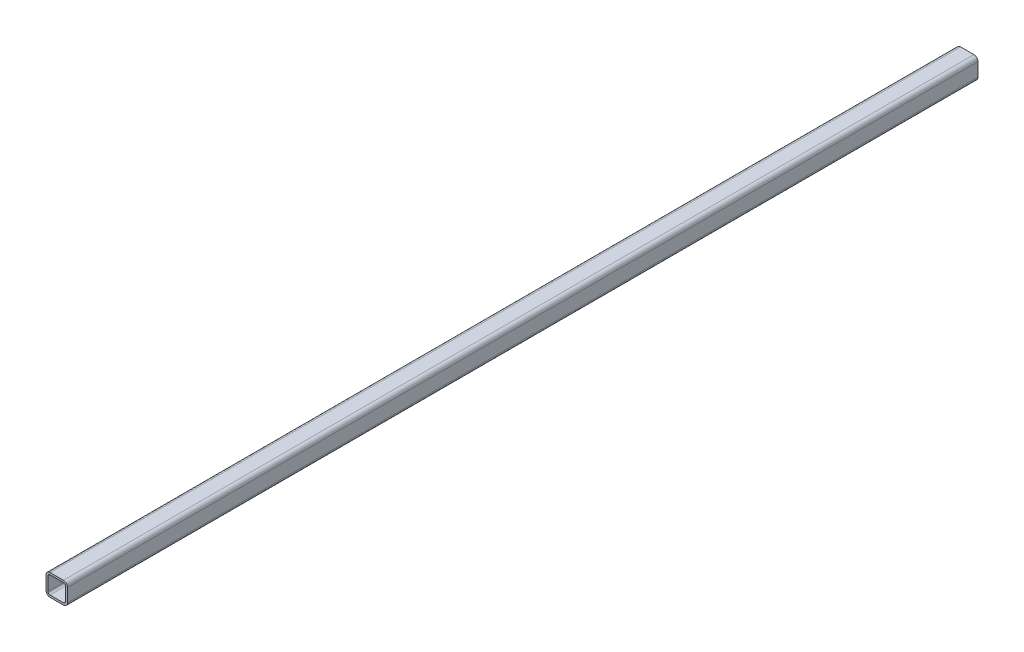
ISO-10303-21;
HEADER;
FILE_DESCRIPTION(('STEP AP214'),'2;1');
FILE_NAME('part.step','',(''),(''),'','','');
FILE_SCHEMA(('AUTOMOTIVE_DESIGN { 1 0 10303 214 1 1 1 1 }'));
ENDSEC;
DATA;
#1=APPLICATION_CONTEXT('core data for automotive mechanical design processes');
#2=APPLICATION_PROTOCOL_DEFINITION('international standard','automotive_design',2000,#1);
#3=PRODUCT_CONTEXT('',#1,'mechanical');
#4=PRODUCT('Part','Part','',(#3));
#5=PRODUCT_RELATED_PRODUCT_CATEGORY('part','',(#4));
#6=PRODUCT_DEFINITION_FORMATION('','',#4);
#7=PRODUCT_DEFINITION_CONTEXT('part definition',#1,'design');
#8=PRODUCT_DEFINITION('design','',#6,#7);
#9=PRODUCT_DEFINITION_SHAPE('','',#8);
#10=(LENGTH_UNIT() NAMED_UNIT(*) SI_UNIT(.MILLI.,.METRE.));
#11=(NAMED_UNIT(*) PLANE_ANGLE_UNIT() SI_UNIT($,.RADIAN.));
#12=(NAMED_UNIT(*) SI_UNIT($,.STERADIAN.) SOLID_ANGLE_UNIT());
#13=UNCERTAINTY_MEASURE_WITH_UNIT(LENGTH_MEASURE(1.E-05),#10,'distance_accuracy_value','');
#14=(GEOMETRIC_REPRESENTATION_CONTEXT(3) GLOBAL_UNCERTAINTY_ASSIGNED_CONTEXT((#13)) GLOBAL_UNIT_ASSIGNED_CONTEXT((#10,
#11,#12)) REPRESENTATION_CONTEXT('',''));
#15=CARTESIAN_POINT('',(0.,0.,0.));
#16=DIRECTION('',(0.,0.,1.));
#17=DIRECTION('',(1.,0.,0.));
#18=AXIS2_PLACEMENT_3D('',#15,#16,#17);
#19=CARTESIAN_POINT('',(41.27,41.27,2150.8));
#20=DIRECTION('',(0.,0.,-1.));
#21=DIRECTION('',(-1.,0.,0.));
#22=AXIS2_PLACEMENT_3D('',#19,#20,#21);
#23=PLANE('',#22);
#24=CARTESIAN_POINT('',(41.27,41.27,2150.8));
#25=DIRECTION('',(0.,0.,1.));
#26=DIRECTION('',(-1.,0.,0.));
#27=AXIS2_PLACEMENT_3D('',#24,#25,#26);
#28=CIRCLE('',#27,9.53);
#29=CARTESIAN_POINT('',(50.8,41.2699999999999,2150.8));
#30=VERTEX_POINT('',#29);
#31=CARTESIAN_POINT('',(41.2699999999999,50.8,2150.8));
#32=VERTEX_POINT('',#31);
#33=EDGE_CURVE('E246',#30,#32,#28,.T.);
#34=ORIENTED_EDGE('',*,*,#33,.T.);
#35=DIRECTION('',(-1.,0.,0.));
#36=VECTOR('',#35,1.);
#37=CARTESIAN_POINT('',(9.53000000000007,50.8,2150.8));
#38=LINE('',#37,#36);
#39=CARTESIAN_POINT('',(9.53000000000007,50.8,2150.8));
#40=VERTEX_POINT('',#39);
#41=EDGE_CURVE('E250',#32,#40,#38,.T.);
#42=ORIENTED_EDGE('',*,*,#41,.T.);
#43=CARTESIAN_POINT('',(9.53,41.27,2150.8));
#44=DIRECTION('',(0.,0.,1.));
#45=DIRECTION('',(-1.,0.,0.));
#46=AXIS2_PLACEMENT_3D('',#43,#44,#45);
#47=CIRCLE('',#46,9.53);
#48=CARTESIAN_POINT('',(0.,41.2699999999999,2150.8));
#49=VERTEX_POINT('',#48);
#50=EDGE_CURVE('E254',#40,#49,#47,.T.);
#51=ORIENTED_EDGE('',*,*,#50,.T.);
#52=DIRECTION('',(0.,-1.,0.));
#53=VECTOR('',#52,1.);
#54=CARTESIAN_POINT('',(0.,9.53000000000007,2150.8));
#55=LINE('',#54,#53);
#56=CARTESIAN_POINT('',(0.,9.53000000000007,2150.8));
#57=VERTEX_POINT('',#56);
#58=EDGE_CURVE('E257',#49,#57,#55,.T.);
#59=ORIENTED_EDGE('',*,*,#58,.T.);
#60=CARTESIAN_POINT('',(9.53,9.53,2150.8));
#61=DIRECTION('',(0.,0.,1.));
#62=DIRECTION('',(-1.,0.,0.));
#63=AXIS2_PLACEMENT_3D('',#60,#61,#62);
#64=CIRCLE('',#63,9.53);
#65=CARTESIAN_POINT('',(9.53000000000007,0.,2150.8));
#66=VERTEX_POINT('',#65);
#67=EDGE_CURVE('E260',#57,#66,#64,.T.);
#68=ORIENTED_EDGE('',*,*,#67,.T.);
#69=DIRECTION('',(1.,0.,0.));
#70=VECTOR('',#69,1.);
#71=CARTESIAN_POINT('',(9.53000000000007,0.,2150.8));
#72=LINE('',#71,#70);
#73=CARTESIAN_POINT('',(41.2699999999999,0.,2150.8));
#74=VERTEX_POINT('',#73);
#75=EDGE_CURVE('E263',#66,#74,#72,.T.);
#76=ORIENTED_EDGE('',*,*,#75,.T.);
#77=CARTESIAN_POINT('',(41.27,9.53,2150.8));
#78=DIRECTION('',(0.,0.,1.));
#79=DIRECTION('',(-1.,0.,0.));
#80=AXIS2_PLACEMENT_3D('',#77,#78,#79);
#81=CIRCLE('',#80,9.53);
#82=CARTESIAN_POINT('',(50.8,9.53000000000007,2150.8));
#83=VERTEX_POINT('',#82);
#84=EDGE_CURVE('E266',#74,#83,#81,.T.);
#85=ORIENTED_EDGE('',*,*,#84,.T.);
#86=DIRECTION('',(0.,1.,0.));
#87=VECTOR('',#86,1.);
#88=CARTESIAN_POINT('',(50.8,9.53000000000007,2150.8));
#89=LINE('',#88,#87);
#90=EDGE_CURVE('E269',#83,#30,#89,.T.);
#91=ORIENTED_EDGE('',*,*,#90,.T.);
#92=EDGE_LOOP('',(#34,#42,#51,#59,#68,#76,#85,#91));
#93=FACE_BOUND('',#92,.T.);
#94=CARTESIAN_POINT('',(9.52,9.52,2150.8));
#95=DIRECTION('',(0.,0.,1.));
#96=DIRECTION('',(1.,0.,0.));
#97=AXIS2_PLACEMENT_3D('',#94,#95,#96);
#98=CIRCLE('',#97,4.76);
#99=CARTESIAN_POINT('',(4.76,9.52000000000003,2150.8));
#100=VERTEX_POINT('',#99);
#101=CARTESIAN_POINT('',(9.52000000000004,4.76,2150.8));
#102=VERTEX_POINT('',#101);
#103=EDGE_CURVE('E157',#100,#102,#98,.T.);
#104=ORIENTED_EDGE('',*,*,#103,.F.);
#105=DIRECTION('',(0.,-1.,0.));
#106=VECTOR('',#105,1.);
#107=CARTESIAN_POINT('',(4.76,41.28,2150.8));
#108=LINE('',#107,#106);
#109=CARTESIAN_POINT('',(4.76,41.28,2150.8));
#110=VERTEX_POINT('',#109);
#111=EDGE_CURVE('E198',#110,#100,#108,.T.);
#112=ORIENTED_EDGE('',*,*,#111,.F.);
#113=CARTESIAN_POINT('',(9.52,41.28,2150.8));
#114=DIRECTION('',(0.,0.,1.));
#115=DIRECTION('',(-1.,0.,0.));
#116=AXIS2_PLACEMENT_3D('',#113,#114,#115);
#117=CIRCLE('',#116,4.76);
#118=CARTESIAN_POINT('',(9.52000000000003,46.04,2150.8));
#119=VERTEX_POINT('',#118);
#120=EDGE_CURVE('E195',#119,#110,#117,.T.);
#121=ORIENTED_EDGE('',*,*,#120,.F.);
#122=DIRECTION('',(-1.,0.,0.));
#123=VECTOR('',#122,1.);
#124=CARTESIAN_POINT('',(9.52000000000003,46.04,2150.8));
#125=LINE('',#124,#123);
#126=CARTESIAN_POINT('',(41.28,46.04,2150.8));
#127=VERTEX_POINT('',#126);
#128=EDGE_CURVE('E192',#127,#119,#125,.T.);
#129=ORIENTED_EDGE('',*,*,#128,.F.);
#130=CARTESIAN_POINT('',(41.28,41.28,2150.8));
#131=DIRECTION('',(0.,0.,1.));
#132=DIRECTION('',(1.,0.,0.));
#133=AXIS2_PLACEMENT_3D('',#130,#131,#132);
#134=CIRCLE('',#133,4.76);
#135=CARTESIAN_POINT('',(46.04,41.28,2150.8));
#136=VERTEX_POINT('',#135);
#137=EDGE_CURVE('E189',#136,#127,#134,.T.);
#138=ORIENTED_EDGE('',*,*,#137,.F.);
#139=DIRECTION('',(0.,1.,0.));
#140=VECTOR('',#139,1.);
#141=CARTESIAN_POINT('',(46.04,41.28,2150.8));
#142=LINE('',#141,#140);
#143=CARTESIAN_POINT('',(46.04,9.52000000000003,2150.8));
#144=VERTEX_POINT('',#143);
#145=EDGE_CURVE('E184',#144,#136,#142,.T.);
#146=ORIENTED_EDGE('',*,*,#145,.F.);
#147=CARTESIAN_POINT('',(41.28,9.52,2150.8));
#148=DIRECTION('',(0.,0.,1.));
#149=DIRECTION('',(1.,0.,0.));
#150=AXIS2_PLACEMENT_3D('',#147,#148,#149);
#151=CIRCLE('',#150,4.76);
#152=CARTESIAN_POINT('',(41.28,4.76,2150.8));
#153=VERTEX_POINT('',#152);
#154=EDGE_CURVE('E180',#153,#144,#151,.T.);
#155=ORIENTED_EDGE('',*,*,#154,.F.);
#156=DIRECTION('',(1.,0.,0.));
#157=VECTOR('',#156,1.);
#158=CARTESIAN_POINT('',(9.52000000000004,4.76,2150.8));
#159=LINE('',#158,#157);
#160=EDGE_CURVE('E166',#102,#153,#159,.T.);
#161=ORIENTED_EDGE('',*,*,#160,.F.);
#162=EDGE_LOOP('',(#104,#112,#121,#129,#138,#146,#155,#161));
#163=FACE_BOUND('',#162,.T.);
#164=ADVANCED_FACE('F43',(#93,#163),#23,.F.);
#165=CARTESIAN_POINT('',(41.27,41.27,0.));
#166=DIRECTION('',(0.,0.,-1.));
#167=DIRECTION('',(-1.,0.,0.));
#168=AXIS2_PLACEMENT_3D('',#165,#166,#167);
#169=PLANE('',#168);
#170=CARTESIAN_POINT('',(41.27,41.27,0.));
#171=DIRECTION('',(0.,0.,1.));
#172=DIRECTION('',(-1.,0.,0.));
#173=AXIS2_PLACEMENT_3D('',#170,#171,#172);
#174=CIRCLE('',#173,9.53);
#175=CARTESIAN_POINT('',(50.8,41.2699999999999,0.));
#176=VERTEX_POINT('',#175);
#177=CARTESIAN_POINT('',(41.2699999999999,50.8,0.));
#178=VERTEX_POINT('',#177);
#179=EDGE_CURVE('E175',#176,#178,#174,.T.);
#180=ORIENTED_EDGE('',*,*,#179,.F.);
#181=DIRECTION('',(0.,1.,0.));
#182=VECTOR('',#181,1.);
#183=CARTESIAN_POINT('',(50.8,9.53000000000007,0.));
#184=LINE('',#183,#182);
#185=CARTESIAN_POINT('',(50.8,9.53000000000007,0.));
#186=VERTEX_POINT('',#185);
#187=EDGE_CURVE('E251',#186,#176,#184,.T.);
#188=ORIENTED_EDGE('',*,*,#187,.F.);
#189=CARTESIAN_POINT('',(41.27,9.53,0.));
#190=DIRECTION('',(0.,0.,1.));
#191=DIRECTION('',(-1.,0.,0.));
#192=AXIS2_PLACEMENT_3D('',#189,#190,#191);
#193=CIRCLE('',#192,9.53);
#194=CARTESIAN_POINT('',(41.2699999999999,0.,0.));
#195=VERTEX_POINT('',#194);
#196=EDGE_CURVE('E291',#195,#186,#193,.T.);
#197=ORIENTED_EDGE('',*,*,#196,.F.);
#198=DIRECTION('',(1.,0.,0.));
#199=VECTOR('',#198,1.);
#200=CARTESIAN_POINT('',(9.53000000000007,0.,0.));
#201=LINE('',#200,#199);
#202=CARTESIAN_POINT('',(9.53000000000007,0.,0.));
#203=VERTEX_POINT('',#202);
#204=EDGE_CURVE('E288',#203,#195,#201,.T.);
#205=ORIENTED_EDGE('',*,*,#204,.F.);
#206=CARTESIAN_POINT('',(9.53,9.53,0.));
#207=DIRECTION('',(0.,0.,1.));
#208=DIRECTION('',(-1.,0.,0.));
#209=AXIS2_PLACEMENT_3D('',#206,#207,#208);
#210=CIRCLE('',#209,9.53);
#211=CARTESIAN_POINT('',(0.,9.53000000000007,0.));
#212=VERTEX_POINT('',#211);
#213=EDGE_CURVE('E285',#212,#203,#210,.T.);
#214=ORIENTED_EDGE('',*,*,#213,.F.);
#215=DIRECTION('',(0.,-1.,0.));
#216=VECTOR('',#215,1.);
#217=CARTESIAN_POINT('',(0.,9.53000000000007,0.));
#218=LINE('',#217,#216);
#219=CARTESIAN_POINT('',(0.,41.2699999999999,0.));
#220=VERTEX_POINT('',#219);
#221=EDGE_CURVE('E282',#220,#212,#218,.T.);
#222=ORIENTED_EDGE('',*,*,#221,.F.);
#223=CARTESIAN_POINT('',(9.53,41.27,0.));
#224=DIRECTION('',(0.,0.,1.));
#225=DIRECTION('',(-1.,0.,0.));
#226=AXIS2_PLACEMENT_3D('',#223,#224,#225);
#227=CIRCLE('',#226,9.53);
#228=CARTESIAN_POINT('',(9.53000000000007,50.8,0.));
#229=VERTEX_POINT('',#228);
#230=EDGE_CURVE('E279',#229,#220,#227,.T.);
#231=ORIENTED_EDGE('',*,*,#230,.F.);
#232=DIRECTION('',(-1.,0.,0.));
#233=VECTOR('',#232,1.);
#234=CARTESIAN_POINT('',(9.53000000000007,50.8,0.));
#235=LINE('',#234,#233);
#236=EDGE_CURVE('E276',#178,#229,#235,.T.);
#237=ORIENTED_EDGE('',*,*,#236,.F.);
#238=EDGE_LOOP('',(#180,#188,#197,#205,#214,#222,#231,#237));
#239=FACE_BOUND('',#238,.T.);
#240=DIRECTION('',(0.,-1.,0.));
#241=VECTOR('',#240,1.);
#242=CARTESIAN_POINT('',(4.76,41.28,0.));
#243=LINE('',#242,#241);
#244=CARTESIAN_POINT('',(4.76,41.28,0.));
#245=VERTEX_POINT('',#244);
#246=CARTESIAN_POINT('',(4.76,9.52000000000004,0.));
#247=VERTEX_POINT('',#246);
#248=EDGE_CURVE('E167',#245,#247,#243,.T.);
#249=ORIENTED_EDGE('',*,*,#248,.T.);
#250=CARTESIAN_POINT('',(9.52,9.52,0.));
#251=DIRECTION('',(0.,0.,1.));
#252=DIRECTION('',(1.,0.,0.));
#253=AXIS2_PLACEMENT_3D('',#250,#251,#252);
#254=CIRCLE('',#253,4.76);
#255=CARTESIAN_POINT('',(9.52000000000004,4.76,0.));
#256=VERTEX_POINT('',#255);
#257=EDGE_CURVE('E67',#247,#256,#254,.T.);
#258=ORIENTED_EDGE('',*,*,#257,.T.);
#259=DIRECTION('',(1.,0.,0.));
#260=VECTOR('',#259,1.);
#261=CARTESIAN_POINT('',(9.52000000000004,4.76,0.));
#262=LINE('',#261,#260);
#263=CARTESIAN_POINT('',(41.28,4.76,0.));
#264=VERTEX_POINT('',#263);
#265=EDGE_CURVE('E173',#256,#264,#262,.T.);
#266=ORIENTED_EDGE('',*,*,#265,.T.);
#267=CARTESIAN_POINT('',(41.28,9.52,0.));
#268=DIRECTION('',(0.,0.,1.));
#269=DIRECTION('',(1.,0.,0.));
#270=AXIS2_PLACEMENT_3D('',#267,#268,#269);
#271=CIRCLE('',#270,4.76);
#272=CARTESIAN_POINT('',(46.04,9.52000000000003,0.));
#273=VERTEX_POINT('',#272);
#274=EDGE_CURVE('E205',#264,#273,#271,.T.);
#275=ORIENTED_EDGE('',*,*,#274,.T.);
#276=DIRECTION('',(0.,1.,0.));
#277=VECTOR('',#276,1.);
#278=CARTESIAN_POINT('',(46.04,41.28,0.));
#279=LINE('',#278,#277);
#280=CARTESIAN_POINT('',(46.04,41.28,0.));
#281=VERTEX_POINT('',#280);
#282=EDGE_CURVE('E209',#273,#281,#279,.T.);
#283=ORIENTED_EDGE('',*,*,#282,.T.);
#284=CARTESIAN_POINT('',(41.28,41.28,0.));
#285=DIRECTION('',(0.,0.,1.));
#286=DIRECTION('',(1.,0.,0.));
#287=AXIS2_PLACEMENT_3D('',#284,#285,#286);
#288=CIRCLE('',#287,4.76);
#289=CARTESIAN_POINT('',(41.28,46.04,0.));
#290=VERTEX_POINT('',#289);
#291=EDGE_CURVE('E213',#281,#290,#288,.T.);
#292=ORIENTED_EDGE('',*,*,#291,.T.);
#293=DIRECTION('',(-1.,0.,0.));
#294=VECTOR('',#293,1.);
#295=CARTESIAN_POINT('',(9.52000000000003,46.04,0.));
#296=LINE('',#295,#294);
#297=CARTESIAN_POINT('',(9.52000000000003,46.04,0.));
#298=VERTEX_POINT('',#297);
#299=EDGE_CURVE('E217',#290,#298,#296,.T.);
#300=ORIENTED_EDGE('',*,*,#299,.T.);
#301=CARTESIAN_POINT('',(9.52,41.28,0.));
#302=DIRECTION('',(0.,0.,1.));
#303=DIRECTION('',(-1.,0.,0.));
#304=AXIS2_PLACEMENT_3D('',#301,#302,#303);
#305=CIRCLE('',#304,4.76);
#306=EDGE_CURVE('E221',#298,#245,#305,.T.);
#307=ORIENTED_EDGE('',*,*,#306,.T.);
#308=EDGE_LOOP('',(#249,#258,#266,#275,#283,#292,#300,#307));
#309=FACE_BOUND('',#308,.T.);
#310=ADVANCED_FACE('F330',(#239,#309),#169,.T.);
#311=CARTESIAN_POINT('',(41.27,41.27,2150.8));
#312=DIRECTION('',(0.,0.,-1.));
#313=DIRECTION('',(-1.,0.,0.));
#314=AXIS2_PLACEMENT_3D('',#311,#312,#313);
#315=CYLINDRICAL_SURFACE('',#314,9.53);
#316=ORIENTED_EDGE('',*,*,#179,.T.);
#317=DIRECTION('',(0.,0.,-1.));
#318=VECTOR('',#317,1.);
#319=CARTESIAN_POINT('',(41.2699999999999,50.8,2150.8));
#320=LINE('',#319,#318);
#321=EDGE_CURVE('E11',#32,#178,#320,.T.);
#322=ORIENTED_EDGE('',*,*,#321,.F.);
#323=ORIENTED_EDGE('',*,*,#33,.F.);
#324=DIRECTION('',(0.,0.,-1.));
#325=VECTOR('',#324,1.);
#326=CARTESIAN_POINT('',(50.8,41.2699999999999,2150.8));
#327=LINE('',#326,#325);
#328=EDGE_CURVE('E272',#30,#176,#327,.T.);
#329=ORIENTED_EDGE('',*,*,#328,.T.);
#330=EDGE_LOOP('',(#316,#322,#323,#329));
#331=FACE_BOUND('',#330,.T.);
#332=ADVANCED_FACE('F45',(#331),#315,.T.);
#333=CARTESIAN_POINT('',(9.53000000000007,50.8,2150.8));
#334=DIRECTION('',(0.,-1.,0.));
#335=DIRECTION('',(0.,0.,-1.));
#336=AXIS2_PLACEMENT_3D('',#333,#334,#335);
#337=PLANE('',#336);
#338=ORIENTED_EDGE('',*,*,#236,.T.);
#339=DIRECTION('',(0.,0.,-1.));
#340=VECTOR('',#339,1.);
#341=CARTESIAN_POINT('',(9.53000000000007,50.8,2150.8));
#342=LINE('',#341,#340);
#343=EDGE_CURVE('E52',#40,#229,#342,.T.);
#344=ORIENTED_EDGE('',*,*,#343,.F.);
#345=ORIENTED_EDGE('',*,*,#41,.F.);
#346=ORIENTED_EDGE('',*,*,#321,.T.);
#347=EDGE_LOOP('',(#338,#344,#345,#346));
#348=FACE_BOUND('',#347,.T.);
#349=ADVANCED_FACE('F347',(#348),#337,.F.);
#350=CARTESIAN_POINT('',(9.53,41.27,2150.8));
#351=DIRECTION('',(0.,0.,-1.));
#352=DIRECTION('',(-1.,0.,0.));
#353=AXIS2_PLACEMENT_3D('',#350,#351,#352);
#354=CYLINDRICAL_SURFACE('',#353,9.53);
#355=ORIENTED_EDGE('',*,*,#230,.T.);
#356=DIRECTION('',(0.,0.,-1.));
#357=VECTOR('',#356,1.);
#358=CARTESIAN_POINT('',(0.,41.2699999999999,2150.8));
#359=LINE('',#358,#357);
#360=EDGE_CURVE('E315',#49,#220,#359,.T.);
#361=ORIENTED_EDGE('',*,*,#360,.F.);
#362=ORIENTED_EDGE('',*,*,#50,.F.);
#363=ORIENTED_EDGE('',*,*,#343,.T.);
#364=EDGE_LOOP('',(#355,#361,#362,#363));
#365=FACE_BOUND('',#364,.T.);
#366=ADVANCED_FACE('F324',(#365),#354,.T.);
#367=CARTESIAN_POINT('',(0.,9.53000000000007,2150.8));
#368=DIRECTION('',(1.,0.,0.));
#369=DIRECTION('',(0.,0.,-1.));
#370=AXIS2_PLACEMENT_3D('',#367,#368,#369);
#371=PLANE('',#370);
#372=ORIENTED_EDGE('',*,*,#221,.T.);
#373=DIRECTION('',(0.,0.,-1.));
#374=VECTOR('',#373,1.);
#375=CARTESIAN_POINT('',(0.,9.53000000000007,2150.8));
#376=LINE('',#375,#374);
#377=EDGE_CURVE('E311',#57,#212,#376,.T.);
#378=ORIENTED_EDGE('',*,*,#377,.F.);
#379=ORIENTED_EDGE('',*,*,#58,.F.);
#380=ORIENTED_EDGE('',*,*,#360,.T.);
#381=EDGE_LOOP('',(#372,#378,#379,#380));
#382=FACE_BOUND('',#381,.T.);
#383=ADVANCED_FACE('F336',(#382),#371,.F.);
#384=CARTESIAN_POINT('',(9.53,9.53,2150.8));
#385=DIRECTION('',(0.,0.,-1.));
#386=DIRECTION('',(-1.,0.,0.));
#387=AXIS2_PLACEMENT_3D('',#384,#385,#386);
#388=CYLINDRICAL_SURFACE('',#387,9.53);
#389=ORIENTED_EDGE('',*,*,#213,.T.);
#390=DIRECTION('',(0.,0.,-1.));
#391=VECTOR('',#390,1.);
#392=CARTESIAN_POINT('',(9.53000000000007,0.,2150.8));
#393=LINE('',#392,#391);
#394=EDGE_CURVE('E307',#66,#203,#393,.T.);
#395=ORIENTED_EDGE('',*,*,#394,.F.);
#396=ORIENTED_EDGE('',*,*,#67,.F.);
#397=ORIENTED_EDGE('',*,*,#377,.T.);
#398=EDGE_LOOP('',(#389,#395,#396,#397));
#399=FACE_BOUND('',#398,.T.);
#400=ADVANCED_FACE('F340',(#399),#388,.T.);
#401=CARTESIAN_POINT('',(9.53000000000007,0.,2150.8));
#402=DIRECTION('',(0.,1.,0.));
#403=DIRECTION('',(0.,0.,1.));
#404=AXIS2_PLACEMENT_3D('',#401,#402,#403);
#405=PLANE('',#404);
#406=ORIENTED_EDGE('',*,*,#204,.T.);
#407=DIRECTION('',(0.,0.,-1.));
#408=VECTOR('',#407,1.);
#409=CARTESIAN_POINT('',(41.2699999999999,0.,2150.8));
#410=LINE('',#409,#408);
#411=EDGE_CURVE('E303',#74,#195,#410,.T.);
#412=ORIENTED_EDGE('',*,*,#411,.F.);
#413=ORIENTED_EDGE('',*,*,#75,.F.);
#414=ORIENTED_EDGE('',*,*,#394,.T.);
#415=EDGE_LOOP('',(#406,#412,#413,#414));
#416=FACE_BOUND('',#415,.T.);
#417=ADVANCED_FACE('F360',(#416),#405,.F.);
#418=CARTESIAN_POINT('',(41.27,9.53,2150.8));
#419=DIRECTION('',(0.,0.,-1.));
#420=DIRECTION('',(-1.,0.,0.));
#421=AXIS2_PLACEMENT_3D('',#418,#419,#420);
#422=CYLINDRICAL_SURFACE('',#421,9.53);
#423=ORIENTED_EDGE('',*,*,#196,.T.);
#424=DIRECTION('',(0.,0.,-1.));
#425=VECTOR('',#424,1.);
#426=CARTESIAN_POINT('',(50.8,9.53000000000007,2150.8));
#427=LINE('',#426,#425);
#428=EDGE_CURVE('E299',#83,#186,#427,.T.);
#429=ORIENTED_EDGE('',*,*,#428,.F.);
#430=ORIENTED_EDGE('',*,*,#84,.F.);
#431=ORIENTED_EDGE('',*,*,#411,.T.);
#432=EDGE_LOOP('',(#423,#429,#430,#431));
#433=FACE_BOUND('',#432,.T.);
#434=ADVANCED_FACE('F358',(#433),#422,.T.);
#435=CARTESIAN_POINT('',(50.8,9.53000000000007,2150.8));
#436=DIRECTION('',(-1.,0.,0.));
#437=DIRECTION('',(0.,0.,1.));
#438=AXIS2_PLACEMENT_3D('',#435,#436,#437);
#439=PLANE('',#438);
#440=ORIENTED_EDGE('',*,*,#187,.T.);
#441=ORIENTED_EDGE('',*,*,#328,.F.);
#442=ORIENTED_EDGE('',*,*,#90,.F.);
#443=ORIENTED_EDGE('',*,*,#428,.T.);
#444=EDGE_LOOP('',(#440,#441,#442,#443));
#445=FACE_BOUND('',#444,.T.);
#446=ADVANCED_FACE('F353',(#445),#439,.F.);
#447=CARTESIAN_POINT('',(9.52,9.52,2150.8));
#448=DIRECTION('',(0.,0.,-1.));
#449=DIRECTION('',(-1.,0.,0.));
#450=AXIS2_PLACEMENT_3D('',#447,#448,#449);
#451=CYLINDRICAL_SURFACE('',#450,4.76);
#452=ORIENTED_EDGE('',*,*,#257,.F.);
#453=DIRECTION('',(0.,0.,-1.));
#454=VECTOR('',#453,1.);
#455=CARTESIAN_POINT('',(4.76,9.52000000000003,2150.8));
#456=LINE('',#455,#454);
#457=EDGE_CURVE('E161',#100,#247,#456,.T.);
#458=ORIENTED_EDGE('',*,*,#457,.F.);
#459=ORIENTED_EDGE('',*,*,#103,.T.);
#460=DIRECTION('',(0.,0.,-1.));
#461=VECTOR('',#460,1.);
#462=CARTESIAN_POINT('',(9.52000000000004,4.76,2150.8));
#463=LINE('',#462,#461);
#464=EDGE_CURVE('E160',#102,#256,#463,.T.);
#465=ORIENTED_EDGE('',*,*,#464,.T.);
#466=EDGE_LOOP('',(#452,#458,#459,#465));
#467=FACE_BOUND('',#466,.T.);
#468=ADVANCED_FACE('F159',(#467),#451,.F.);
#469=CARTESIAN_POINT('',(9.52000000000004,4.76,2150.8));
#470=DIRECTION('',(0.,1.,0.));
#471=DIRECTION('',(-1.,0.,0.));
#472=AXIS2_PLACEMENT_3D('',#469,#470,#471);
#473=PLANE('',#472);
#474=ORIENTED_EDGE('',*,*,#265,.F.);
#475=ORIENTED_EDGE('',*,*,#464,.F.);
#476=ORIENTED_EDGE('',*,*,#160,.T.);
#477=DIRECTION('',(0.,0.,-1.));
#478=VECTOR('',#477,1.);
#479=CARTESIAN_POINT('',(41.28,4.76,2150.8));
#480=LINE('',#479,#478);
#481=EDGE_CURVE('E176',#153,#264,#480,.T.);
#482=ORIENTED_EDGE('',*,*,#481,.T.);
#483=EDGE_LOOP('',(#474,#475,#476,#482));
#484=FACE_BOUND('',#483,.T.);
#485=ADVANCED_FACE('F170',(#484),#473,.T.);
#486=CARTESIAN_POINT('',(41.28,9.52,2150.8));
#487=DIRECTION('',(0.,0.,-1.));
#488=DIRECTION('',(-1.,0.,0.));
#489=AXIS2_PLACEMENT_3D('',#486,#487,#488);
#490=CYLINDRICAL_SURFACE('',#489,4.76);
#491=ORIENTED_EDGE('',*,*,#274,.F.);
#492=ORIENTED_EDGE('',*,*,#481,.F.);
#493=ORIENTED_EDGE('',*,*,#154,.T.);
#494=DIRECTION('',(0.,0.,-1.));
#495=VECTOR('',#494,1.);
#496=CARTESIAN_POINT('',(46.04,9.52000000000003,2150.8));
#497=LINE('',#496,#495);
#498=EDGE_CURVE('E241',#144,#273,#497,.T.);
#499=ORIENTED_EDGE('',*,*,#498,.T.);
#500=EDGE_LOOP('',(#491,#492,#493,#499));
#501=FACE_BOUND('',#500,.T.);
#502=ADVANCED_FACE('F385',(#501),#490,.F.);
#503=CARTESIAN_POINT('',(46.04,41.28,2150.8));
#504=DIRECTION('',(-1.,0.,0.));
#505=DIRECTION('',(0.,-1.,0.));
#506=AXIS2_PLACEMENT_3D('',#503,#504,#505);
#507=PLANE('',#506);
#508=ORIENTED_EDGE('',*,*,#282,.F.);
#509=ORIENTED_EDGE('',*,*,#498,.F.);
#510=ORIENTED_EDGE('',*,*,#145,.T.);
#511=DIRECTION('',(0.,0.,-1.));
#512=VECTOR('',#511,1.);
#513=CARTESIAN_POINT('',(46.04,41.28,2150.8));
#514=LINE('',#513,#512);
#515=EDGE_CURVE('E238',#136,#281,#514,.T.);
#516=ORIENTED_EDGE('',*,*,#515,.T.);
#517=EDGE_LOOP('',(#508,#509,#510,#516));
#518=FACE_BOUND('',#517,.T.);
#519=ADVANCED_FACE('F389',(#518),#507,.T.);
#520=CARTESIAN_POINT('',(41.28,41.28,2150.8));
#521=DIRECTION('',(0.,0.,-1.));
#522=DIRECTION('',(-1.,0.,0.));
#523=AXIS2_PLACEMENT_3D('',#520,#521,#522);
#524=CYLINDRICAL_SURFACE('',#523,4.76);
#525=ORIENTED_EDGE('',*,*,#291,.F.);
#526=ORIENTED_EDGE('',*,*,#515,.F.);
#527=ORIENTED_EDGE('',*,*,#137,.T.);
#528=DIRECTION('',(0.,0.,-1.));
#529=VECTOR('',#528,1.);
#530=CARTESIAN_POINT('',(41.28,46.04,2150.8));
#531=LINE('',#530,#529);
#532=EDGE_CURVE('E235',#127,#290,#531,.T.);
#533=ORIENTED_EDGE('',*,*,#532,.T.);
#534=EDGE_LOOP('',(#525,#526,#527,#533));
#535=FACE_BOUND('',#534,.T.);
#536=ADVANCED_FACE('F395',(#535),#524,.F.);
#537=CARTESIAN_POINT('',(9.52000000000003,46.04,2150.8));
#538=DIRECTION('',(0.,-1.,0.));
#539=DIRECTION('',(0.,0.,-1.));
#540=AXIS2_PLACEMENT_3D('',#537,#538,#539);
#541=PLANE('',#540);
#542=ORIENTED_EDGE('',*,*,#299,.F.);
#543=ORIENTED_EDGE('',*,*,#532,.F.);
#544=ORIENTED_EDGE('',*,*,#128,.T.);
#545=DIRECTION('',(0.,0.,-1.));
#546=VECTOR('',#545,1.);
#547=CARTESIAN_POINT('',(9.52000000000003,46.04,2150.8));
#548=LINE('',#547,#546);
#549=EDGE_CURVE('E232',#119,#298,#548,.T.);
#550=ORIENTED_EDGE('',*,*,#549,.T.);
#551=EDGE_LOOP('',(#542,#543,#544,#550));
#552=FACE_BOUND('',#551,.T.);
#553=ADVANCED_FACE('F399',(#552),#541,.T.);
#554=CARTESIAN_POINT('',(9.52,41.28,2150.8));
#555=DIRECTION('',(0.,0.,-1.));
#556=DIRECTION('',(-1.,0.,0.));
#557=AXIS2_PLACEMENT_3D('',#554,#555,#556);
#558=CYLINDRICAL_SURFACE('',#557,4.76);
#559=ORIENTED_EDGE('',*,*,#306,.F.);
#560=ORIENTED_EDGE('',*,*,#549,.F.);
#561=ORIENTED_EDGE('',*,*,#120,.T.);
#562=DIRECTION('',(0.,0.,-1.));
#563=VECTOR('',#562,1.);
#564=CARTESIAN_POINT('',(4.76,41.28,2150.8));
#565=LINE('',#564,#563);
#566=EDGE_CURVE('E59',#110,#245,#565,.T.);
#567=ORIENTED_EDGE('',*,*,#566,.T.);
#568=EDGE_LOOP('',(#559,#560,#561,#567));
#569=FACE_BOUND('',#568,.T.);
#570=ADVANCED_FACE('F403',(#569),#558,.F.);
#571=CARTESIAN_POINT('',(4.76,41.28,2150.8));
#572=DIRECTION('',(1.,0.,0.));
#573=DIRECTION('',(0.,1.,0.));
#574=AXIS2_PLACEMENT_3D('',#571,#572,#573);
#575=PLANE('',#574);
#576=ORIENTED_EDGE('',*,*,#248,.F.);
#577=ORIENTED_EDGE('',*,*,#566,.F.);
#578=ORIENTED_EDGE('',*,*,#111,.T.);
#579=ORIENTED_EDGE('',*,*,#457,.T.);
#580=EDGE_LOOP('',(#576,#577,#578,#579));
#581=FACE_BOUND('',#580,.T.);
#582=ADVANCED_FACE('F407',(#581),#575,.T.);
#583=CLOSED_SHELL('',(#164,#310,#332,#349,#366,#383,#400,#417,#434,#446,#468,#485,#502,#519,
#536,#553,#570,#582));
#584=MANIFOLD_SOLID_BREP('B2',#583);
#585=ADVANCED_BREP_SHAPE_REPRESENTATION('',(#18,#584),#14);
#586=SHAPE_DEFINITION_REPRESENTATION(#9,#585);
ENDSEC;
END-ISO-10303-21;
